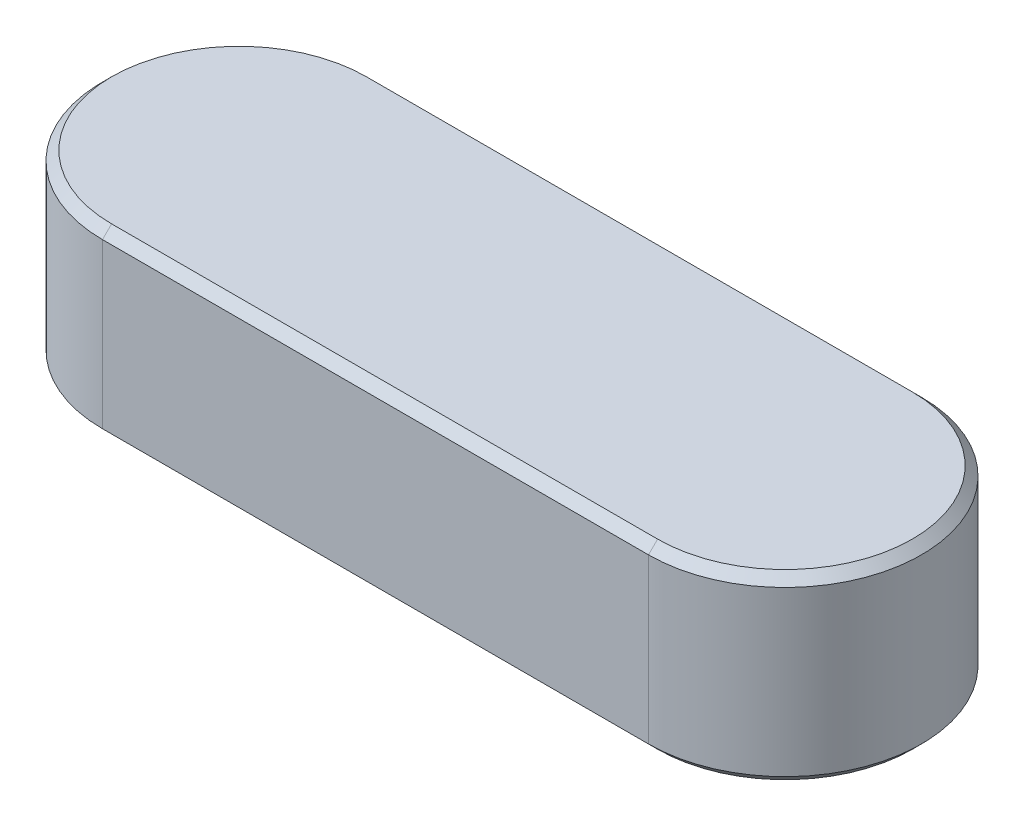
ISO-10303-21;
HEADER;
FILE_DESCRIPTION(('STEP AP214'),'2;1');
FILE_NAME('part.step','',(''),(''),'','','');
FILE_SCHEMA(('AUTOMOTIVE_DESIGN { 1 0 10303 214 1 1 1 1 }'));
ENDSEC;
DATA;
#1=APPLICATION_CONTEXT('core data for automotive mechanical design processes');
#2=APPLICATION_PROTOCOL_DEFINITION('international standard','automotive_design',2000,#1);
#3=PRODUCT_CONTEXT('',#1,'mechanical');
#4=PRODUCT('Part','Part','',(#3));
#5=PRODUCT_RELATED_PRODUCT_CATEGORY('part','',(#4));
#6=PRODUCT_DEFINITION_FORMATION('','',#4);
#7=PRODUCT_DEFINITION_CONTEXT('part definition',#1,'design');
#8=PRODUCT_DEFINITION('design','',#6,#7);
#9=PRODUCT_DEFINITION_SHAPE('','',#8);
#10=(LENGTH_UNIT() NAMED_UNIT(*) SI_UNIT(.MILLI.,.METRE.));
#11=(NAMED_UNIT(*) PLANE_ANGLE_UNIT() SI_UNIT($,.RADIAN.));
#12=(NAMED_UNIT(*) SI_UNIT($,.STERADIAN.) SOLID_ANGLE_UNIT());
#13=UNCERTAINTY_MEASURE_WITH_UNIT(LENGTH_MEASURE(1.E-05),#10,'distance_accuracy_value','');
#14=(GEOMETRIC_REPRESENTATION_CONTEXT(3) GLOBAL_UNCERTAINTY_ASSIGNED_CONTEXT((#13)) GLOBAL_UNIT_ASSIGNED_CONTEXT((#10,
#11,#12)) REPRESENTATION_CONTEXT('',''));
#15=CARTESIAN_POINT('',(0.,0.,0.));
#16=DIRECTION('',(0.,0.,1.));
#17=DIRECTION('',(1.,0.,0.));
#18=AXIS2_PLACEMENT_3D('',#15,#16,#17);
#19=CARTESIAN_POINT('',(-12.,8.,0.));
#20=DIRECTION('',(0.,-1.,0.));
#21=DIRECTION('',(0.,0.,-1.));
#22=AXIS2_PLACEMENT_3D('',#19,#20,#21);
#23=CYLINDRICAL_SURFACE('',#22,6.);
#24=DIRECTION('',(0.,-1.,0.));
#25=VECTOR('',#24,1.);
#26=CARTESIAN_POINT('',(-12.,8.,-6.));
#27=LINE('',#26,#25);
#28=CARTESIAN_POINT('',(-12.,7.6,-6.));
#29=VERTEX_POINT('',#28);
#30=CARTESIAN_POINT('',(-12.,0.399999999999997,-6.));
#31=VERTEX_POINT('',#30);
#32=EDGE_CURVE('E130',#29,#31,#27,.T.);
#33=ORIENTED_EDGE('',*,*,#32,.T.);
#34=CARTESIAN_POINT('',(-12.,0.399999999999997,0.));
#35=DIRECTION('',(0.,1.,0.));
#36=DIRECTION('',(0.,0.,1.));
#37=AXIS2_PLACEMENT_3D('',#34,#35,#36);
#38=CIRCLE('',#37,6.);
#39=CARTESIAN_POINT('',(-12.,0.399999999999997,6.));
#40=VERTEX_POINT('',#39);
#41=EDGE_CURVE('E136',#31,#40,#38,.T.);
#42=ORIENTED_EDGE('',*,*,#41,.T.);
#43=DIRECTION('',(0.,-1.,0.));
#44=VECTOR('',#43,1.);
#45=CARTESIAN_POINT('',(-12.,8.,6.));
#46=LINE('',#45,#44);
#47=CARTESIAN_POINT('',(-12.,7.6,6.));
#48=VERTEX_POINT('',#47);
#49=EDGE_CURVE('E124',#48,#40,#46,.T.);
#50=ORIENTED_EDGE('',*,*,#49,.F.);
#51=CARTESIAN_POINT('',(-12.,7.6,0.));
#52=DIRECTION('',(0.,1.,0.));
#53=DIRECTION('',(0.,0.,1.));
#54=AXIS2_PLACEMENT_3D('',#51,#52,#53);
#55=CIRCLE('',#54,6.);
#56=EDGE_CURVE('E127',#48,#29,#55,.F.);
#57=ORIENTED_EDGE('',*,*,#56,.T.);
#58=EDGE_LOOP('',(#33,#42,#50,#57));
#59=FACE_BOUND('',#58,.T.);
#60=ADVANCED_FACE('F35',(#59),#23,.T.);
#61=CARTESIAN_POINT('',(-12.,8.,6.));
#62=DIRECTION('',(0.,0.,-1.));
#63=DIRECTION('',(-1.,0.,0.));
#64=AXIS2_PLACEMENT_3D('',#61,#62,#63);
#65=PLANE('',#64);
#66=ORIENTED_EDGE('',*,*,#49,.T.);
#67=DIRECTION('',(1.,0.,0.));
#68=VECTOR('',#67,1.);
#69=CARTESIAN_POINT('',(-12.,0.399999999999997,6.));
#70=LINE('',#69,#68);
#71=CARTESIAN_POINT('',(12.,0.399999999999997,6.));
#72=VERTEX_POINT('',#71);
#73=EDGE_CURVE('E58',#40,#72,#70,.T.);
#74=ORIENTED_EDGE('',*,*,#73,.T.);
#75=DIRECTION('',(0.,-1.,0.));
#76=VECTOR('',#75,1.);
#77=CARTESIAN_POINT('',(12.,8.,6.));
#78=LINE('',#77,#76);
#79=CARTESIAN_POINT('',(12.,7.6,6.));
#80=VERTEX_POINT('',#79);
#81=EDGE_CURVE('E177',#80,#72,#78,.T.);
#82=ORIENTED_EDGE('',*,*,#81,.F.);
#83=DIRECTION('',(-1.,0.,0.));
#84=VECTOR('',#83,1.);
#85=CARTESIAN_POINT('',(-12.,7.6,6.));
#86=LINE('',#85,#84);
#87=EDGE_CURVE('E140',#80,#48,#86,.T.);
#88=ORIENTED_EDGE('',*,*,#87,.T.);
#89=EDGE_LOOP('',(#66,#74,#82,#88));
#90=FACE_BOUND('',#89,.T.);
#91=ADVANCED_FACE('F202',(#90),#65,.F.);
#92=CARTESIAN_POINT('',(12.,8.,0.));
#93=DIRECTION('',(0.,-1.,0.));
#94=DIRECTION('',(0.,0.,-1.));
#95=AXIS2_PLACEMENT_3D('',#92,#93,#94);
#96=CYLINDRICAL_SURFACE('',#95,6.);
#97=ORIENTED_EDGE('',*,*,#81,.T.);
#98=CARTESIAN_POINT('',(12.,0.399999999999997,0.));
#99=DIRECTION('',(0.,1.,0.));
#100=DIRECTION('',(0.,0.,1.));
#101=AXIS2_PLACEMENT_3D('',#98,#99,#100);
#102=CIRCLE('',#101,6.);
#103=CARTESIAN_POINT('',(12.,0.399999999999997,-6.));
#104=VERTEX_POINT('',#103);
#105=EDGE_CURVE('E11',#72,#104,#102,.T.);
#106=ORIENTED_EDGE('',*,*,#105,.T.);
#107=DIRECTION('',(0.,-1.,0.));
#108=VECTOR('',#107,1.);
#109=CARTESIAN_POINT('',(12.,8.,-6.));
#110=LINE('',#109,#108);
#111=CARTESIAN_POINT('',(12.,7.6,-6.));
#112=VERTEX_POINT('',#111);
#113=EDGE_CURVE('E179',#112,#104,#110,.T.);
#114=ORIENTED_EDGE('',*,*,#113,.F.);
#115=CARTESIAN_POINT('',(12.,7.6,0.));
#116=DIRECTION('',(0.,1.,0.));
#117=DIRECTION('',(0.,0.,1.));
#118=AXIS2_PLACEMENT_3D('',#115,#116,#117);
#119=CIRCLE('',#118,6.);
#120=EDGE_CURVE('E169',#112,#80,#119,.F.);
#121=ORIENTED_EDGE('',*,*,#120,.T.);
#122=EDGE_LOOP('',(#97,#106,#114,#121));
#123=FACE_BOUND('',#122,.T.);
#124=ADVANCED_FACE('F207',(#123),#96,.T.);
#125=CARTESIAN_POINT('',(-12.,8.,-6.));
#126=DIRECTION('',(0.,0.,1.));
#127=DIRECTION('',(1.,0.,0.));
#128=AXIS2_PLACEMENT_3D('',#125,#126,#127);
#129=PLANE('',#128);
#130=ORIENTED_EDGE('',*,*,#113,.T.);
#131=DIRECTION('',(-1.,0.,0.));
#132=VECTOR('',#131,1.);
#133=CARTESIAN_POINT('',(-12.,0.399999999999997,-6.));
#134=LINE('',#133,#132);
#135=EDGE_CURVE('E44',#104,#31,#134,.T.);
#136=ORIENTED_EDGE('',*,*,#135,.T.);
#137=ORIENTED_EDGE('',*,*,#32,.F.);
#138=DIRECTION('',(1.,0.,0.));
#139=VECTOR('',#138,1.);
#140=CARTESIAN_POINT('',(12.,7.6,-6.));
#141=LINE('',#140,#139);
#142=EDGE_CURVE('E171',#29,#112,#141,.T.);
#143=ORIENTED_EDGE('',*,*,#142,.T.);
#144=EDGE_LOOP('',(#130,#136,#137,#143));
#145=FACE_BOUND('',#144,.T.);
#146=ADVANCED_FACE('F230',(#145),#129,.F.);
#147=CARTESIAN_POINT('',(-12.,8.,0.));
#148=DIRECTION('',(0.,1.,0.));
#149=DIRECTION('',(0.,0.,1.));
#150=AXIS2_PLACEMENT_3D('',#147,#148,#149);
#151=PLANE('',#150);
#152=CARTESIAN_POINT('',(12.,8.,0.));
#153=DIRECTION('',(0.,1.,0.));
#154=DIRECTION('',(0.,0.,1.));
#155=AXIS2_PLACEMENT_3D('',#152,#153,#154);
#156=CIRCLE('',#155,5.6);
#157=CARTESIAN_POINT('',(12.,8.,5.6));
#158=VERTEX_POINT('',#157);
#159=CARTESIAN_POINT('',(12.,8.,-5.6));
#160=VERTEX_POINT('',#159);
#161=EDGE_CURVE('E113',#158,#160,#156,.T.);
#162=ORIENTED_EDGE('',*,*,#161,.T.);
#163=DIRECTION('',(-1.,0.,0.));
#164=VECTOR('',#163,1.);
#165=CARTESIAN_POINT('',(-12.,8.,-5.6));
#166=LINE('',#165,#164);
#167=CARTESIAN_POINT('',(-12.,8.,-5.6));
#168=VERTEX_POINT('',#167);
#169=EDGE_CURVE('E109',#160,#168,#166,.T.);
#170=ORIENTED_EDGE('',*,*,#169,.T.);
#171=CARTESIAN_POINT('',(-12.,8.,0.));
#172=DIRECTION('',(0.,1.,0.));
#173=DIRECTION('',(0.,0.,1.));
#174=AXIS2_PLACEMENT_3D('',#171,#172,#173);
#175=CIRCLE('',#174,5.6);
#176=CARTESIAN_POINT('',(-12.,8.,5.6));
#177=VERTEX_POINT('',#176);
#178=EDGE_CURVE('E103',#168,#177,#175,.T.);
#179=ORIENTED_EDGE('',*,*,#178,.T.);
#180=DIRECTION('',(1.,0.,0.));
#181=VECTOR('',#180,1.);
#182=CARTESIAN_POINT('',(12.,8.,5.6));
#183=LINE('',#182,#181);
#184=EDGE_CURVE('E106',#177,#158,#183,.T.);
#185=ORIENTED_EDGE('',*,*,#184,.T.);
#186=EDGE_LOOP('',(#162,#170,#179,#185));
#187=FACE_BOUND('',#186,.T.);
#188=ADVANCED_FACE('F105',(#187),#151,.T.);
#189=CARTESIAN_POINT('',(-12.,0.,0.));
#190=DIRECTION('',(0.,1.,0.));
#191=DIRECTION('',(0.,0.,1.));
#192=AXIS2_PLACEMENT_3D('',#189,#190,#191);
#193=PLANE('',#192);
#194=DIRECTION('',(-1.,0.,0.));
#195=VECTOR('',#194,1.);
#196=CARTESIAN_POINT('',(-12.,0.,5.60000000000001));
#197=LINE('',#196,#195);
#198=CARTESIAN_POINT('',(12.,0.,5.60000000000001));
#199=VERTEX_POINT('',#198);
#200=CARTESIAN_POINT('',(-12.,0.,5.60000000000001));
#201=VERTEX_POINT('',#200);
#202=EDGE_CURVE('E144',#199,#201,#197,.T.);
#203=ORIENTED_EDGE('',*,*,#202,.T.);
#204=CARTESIAN_POINT('',(-12.,0.,0.));
#205=DIRECTION('',(0.,1.,0.));
#206=DIRECTION('',(0.,0.,1.));
#207=AXIS2_PLACEMENT_3D('',#204,#205,#206);
#208=CIRCLE('',#207,5.60000000000001);
#209=CARTESIAN_POINT('',(-12.,0.,-5.60000000000001));
#210=VERTEX_POINT('',#209);
#211=EDGE_CURVE('E146',#201,#210,#208,.F.);
#212=ORIENTED_EDGE('',*,*,#211,.T.);
#213=DIRECTION('',(1.,0.,0.));
#214=VECTOR('',#213,1.);
#215=CARTESIAN_POINT('',(-12.,0.,-5.60000000000001));
#216=LINE('',#215,#214);
#217=CARTESIAN_POINT('',(12.,0.,-5.60000000000001));
#218=VERTEX_POINT('',#217);
#219=EDGE_CURVE('E142',#210,#218,#216,.T.);
#220=ORIENTED_EDGE('',*,*,#219,.T.);
#221=CARTESIAN_POINT('',(12.,0.,0.));
#222=DIRECTION('',(0.,1.,0.));
#223=DIRECTION('',(0.,0.,1.));
#224=AXIS2_PLACEMENT_3D('',#221,#222,#223);
#225=CIRCLE('',#224,5.60000000000001);
#226=EDGE_CURVE('E139',#218,#199,#225,.F.);
#227=ORIENTED_EDGE('',*,*,#226,.T.);
#228=EDGE_LOOP('',(#203,#212,#220,#227));
#229=FACE_BOUND('',#228,.T.);
#230=ADVANCED_FACE('F221',(#229),#193,.F.);
#231=CARTESIAN_POINT('',(-12.,8.,5.6));
#232=DIRECTION('',(0.,0.707106781186547,0.707106781186547));
#233=DIRECTION('',(-1.,0.,0.));
#234=AXIS2_PLACEMENT_3D('',#231,#232,#233);
#235=PLANE('',#234);
#236=DIRECTION('',(0.,0.707106781186547,-0.707106781186547));
#237=VECTOR('',#236,1.);
#238=CARTESIAN_POINT('',(-12.,7.6,6.));
#239=LINE('',#238,#237);
#240=EDGE_CURVE('E119',#48,#177,#239,.T.);
#241=ORIENTED_EDGE('',*,*,#240,.F.);
#242=ORIENTED_EDGE('',*,*,#87,.F.);
#243=DIRECTION('',(0.,-0.707106781186547,0.707106781186547));
#244=VECTOR('',#243,1.);
#245=CARTESIAN_POINT('',(12.,8.,5.6));
#246=LINE('',#245,#244);
#247=EDGE_CURVE('E122',#158,#80,#246,.T.);
#248=ORIENTED_EDGE('',*,*,#247,.F.);
#249=ORIENTED_EDGE('',*,*,#184,.F.);
#250=EDGE_LOOP('',(#241,#242,#248,#249));
#251=FACE_BOUND('',#250,.T.);
#252=ADVANCED_FACE('F117',(#251),#235,.T.);
#253=CARTESIAN_POINT('',(12.,8.,0.));
#254=DIRECTION('',(0.,-1.,0.));
#255=DIRECTION('',(0.,0.,-1.));
#256=AXIS2_PLACEMENT_3D('',#253,#254,#255);
#257=CONICAL_SURFACE('',#256,5.6,0.785398163397448);
#258=ORIENTED_EDGE('',*,*,#247,.T.);
#259=ORIENTED_EDGE('',*,*,#120,.F.);
#260=DIRECTION('',(0.,-0.707106781186547,-0.707106781186547));
#261=VECTOR('',#260,1.);
#262=CARTESIAN_POINT('',(12.,8.,-5.6));
#263=LINE('',#262,#261);
#264=EDGE_CURVE('E128',#160,#112,#263,.T.);
#265=ORIENTED_EDGE('',*,*,#264,.F.);
#266=ORIENTED_EDGE('',*,*,#161,.F.);
#267=EDGE_LOOP('',(#258,#259,#265,#266));
#268=FACE_BOUND('',#267,.T.);
#269=ADVANCED_FACE('F216',(#268),#257,.T.);
#270=CARTESIAN_POINT('',(-12.,8.,0.));
#271=DIRECTION('',(0.,-1.,0.));
#272=DIRECTION('',(0.,0.,-1.));
#273=AXIS2_PLACEMENT_3D('',#270,#271,#272);
#274=CONICAL_SURFACE('',#273,5.6,0.785398163397448);
#275=ORIENTED_EDGE('',*,*,#240,.T.);
#276=ORIENTED_EDGE('',*,*,#178,.F.);
#277=DIRECTION('',(0.,0.707106781186547,0.707106781186547));
#278=VECTOR('',#277,1.);
#279=CARTESIAN_POINT('',(-12.,7.6,-6.));
#280=LINE('',#279,#278);
#281=EDGE_CURVE('E132',#29,#168,#280,.T.);
#282=ORIENTED_EDGE('',*,*,#281,.F.);
#283=ORIENTED_EDGE('',*,*,#56,.F.);
#284=EDGE_LOOP('',(#275,#276,#282,#283));
#285=FACE_BOUND('',#284,.T.);
#286=ADVANCED_FACE('F126',(#285),#274,.T.);
#287=CARTESIAN_POINT('',(-12.,8.,-5.6));
#288=DIRECTION('',(0.,0.707106781186547,-0.707106781186547));
#289=DIRECTION('',(1.,0.,0.));
#290=AXIS2_PLACEMENT_3D('',#287,#288,#289);
#291=PLANE('',#290);
#292=ORIENTED_EDGE('',*,*,#264,.T.);
#293=ORIENTED_EDGE('',*,*,#142,.F.);
#294=ORIENTED_EDGE('',*,*,#281,.T.);
#295=ORIENTED_EDGE('',*,*,#169,.F.);
#296=EDGE_LOOP('',(#292,#293,#294,#295));
#297=FACE_BOUND('',#296,.T.);
#298=ADVANCED_FACE('F211',(#297),#291,.T.);
#299=CARTESIAN_POINT('',(12.,0.399999999999997,0.));
#300=DIRECTION('',(0.,1.,0.));
#301=DIRECTION('',(0.,0.,1.));
#302=AXIS2_PLACEMENT_3D('',#299,#300,#301);
#303=CONICAL_SURFACE('',#302,6.,0.785398163397445);
#304=DIRECTION('',(0.,0.70710678118655,0.707106781186545));
#305=VECTOR('',#304,1.);
#306=CARTESIAN_POINT('',(12.,0.,5.60000000000001));
#307=LINE('',#306,#305);
#308=EDGE_CURVE('E154',#199,#72,#307,.T.);
#309=ORIENTED_EDGE('',*,*,#308,.F.);
#310=ORIENTED_EDGE('',*,*,#226,.F.);
#311=DIRECTION('',(0.,-0.70710678118655,0.707106781186545));
#312=VECTOR('',#311,1.);
#313=CARTESIAN_POINT('',(12.,0.399999999999997,-6.));
#314=LINE('',#313,#312);
#315=EDGE_CURVE('E39',#104,#218,#314,.T.);
#316=ORIENTED_EDGE('',*,*,#315,.F.);
#317=ORIENTED_EDGE('',*,*,#105,.F.);
#318=EDGE_LOOP('',(#309,#310,#316,#317));
#319=FACE_BOUND('',#318,.T.);
#320=ADVANCED_FACE('F37',(#319),#303,.T.);
#321=CARTESIAN_POINT('',(-12.,0.399999999999997,-6.));
#322=DIRECTION('',(0.,0.707106781186545,0.70710678118655));
#323=DIRECTION('',(-1.,0.,0.));
#324=AXIS2_PLACEMENT_3D('',#321,#322,#323);
#325=PLANE('',#324);
#326=ORIENTED_EDGE('',*,*,#315,.T.);
#327=ORIENTED_EDGE('',*,*,#219,.F.);
#328=DIRECTION('',(0.,-0.70710678118655,0.707106781186545));
#329=VECTOR('',#328,1.);
#330=CARTESIAN_POINT('',(-12.,0.399999999999997,-6.));
#331=LINE('',#330,#329);
#332=EDGE_CURVE('E153',#31,#210,#331,.T.);
#333=ORIENTED_EDGE('',*,*,#332,.F.);
#334=ORIENTED_EDGE('',*,*,#135,.F.);
#335=EDGE_LOOP('',(#326,#327,#333,#334));
#336=FACE_BOUND('',#335,.T.);
#337=ADVANCED_FACE('F188',(#336),#325,.F.);
#338=CARTESIAN_POINT('',(-12.,0.399999999999997,6.));
#339=DIRECTION('',(0.,0.707106781186545,-0.70710678118655));
#340=DIRECTION('',(1.,0.,0.));
#341=AXIS2_PLACEMENT_3D('',#338,#339,#340);
#342=PLANE('',#341);
#343=ORIENTED_EDGE('',*,*,#308,.T.);
#344=ORIENTED_EDGE('',*,*,#73,.F.);
#345=DIRECTION('',(0.,0.70710678118655,0.707106781186545));
#346=VECTOR('',#345,1.);
#347=CARTESIAN_POINT('',(-12.,0.,5.60000000000001));
#348=LINE('',#347,#346);
#349=EDGE_CURVE('E151',#201,#40,#348,.T.);
#350=ORIENTED_EDGE('',*,*,#349,.F.);
#351=ORIENTED_EDGE('',*,*,#202,.F.);
#352=EDGE_LOOP('',(#343,#344,#350,#351));
#353=FACE_BOUND('',#352,.T.);
#354=ADVANCED_FACE('F193',(#353),#342,.F.);
#355=CARTESIAN_POINT('',(-12.,0.399999999999997,0.));
#356=DIRECTION('',(0.,1.,0.));
#357=DIRECTION('',(0.,0.,1.));
#358=AXIS2_PLACEMENT_3D('',#355,#356,#357);
#359=CONICAL_SURFACE('',#358,6.,0.785398163397445);
#360=ORIENTED_EDGE('',*,*,#332,.T.);
#361=ORIENTED_EDGE('',*,*,#211,.F.);
#362=ORIENTED_EDGE('',*,*,#349,.T.);
#363=ORIENTED_EDGE('',*,*,#41,.F.);
#364=EDGE_LOOP('',(#360,#361,#362,#363));
#365=FACE_BOUND('',#364,.T.);
#366=ADVANCED_FACE('F191',(#365),#359,.T.);
#367=CLOSED_SHELL('',(#60,#91,#124,#146,#188,#230,#252,#269,#286,#298,#320,#337,#354,#366));
#368=MANIFOLD_SOLID_BREP('B2',#367);
#369=ADVANCED_BREP_SHAPE_REPRESENTATION('',(#18,#368),#14);
#370=SHAPE_DEFINITION_REPRESENTATION(#9,#369);
ENDSEC;
END-ISO-10303-21;
